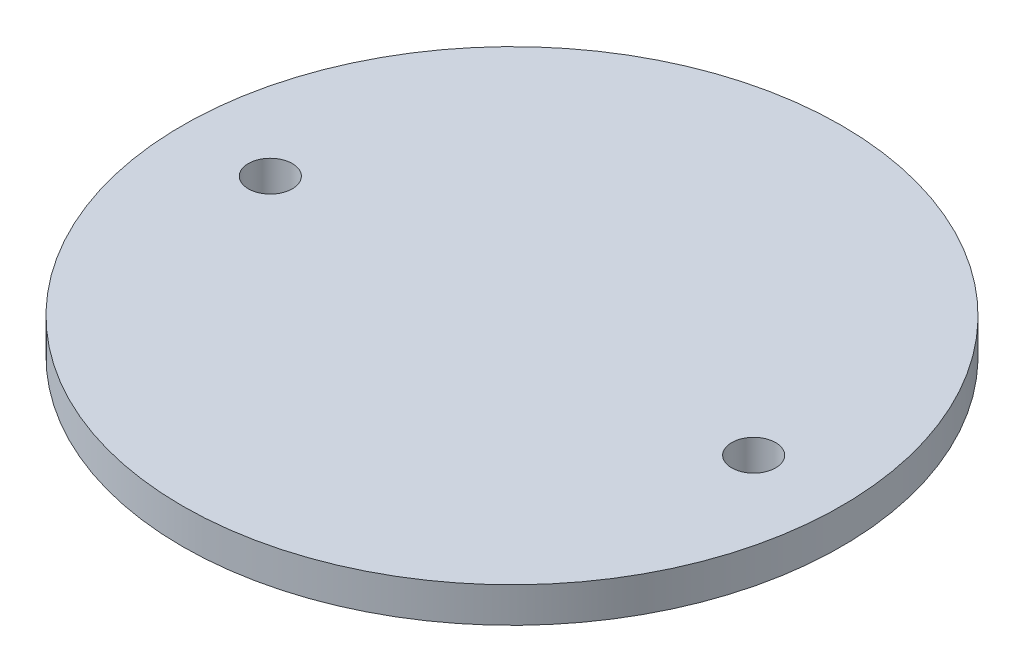
ISO-10303-21;
HEADER;
FILE_DESCRIPTION(('STEP AP214'),'2;1');
FILE_NAME('part.step','',(''),(''),'','','');
FILE_SCHEMA(('AUTOMOTIVE_DESIGN { 1 0 10303 214 1 1 1 1 }'));
ENDSEC;
DATA;
#1=APPLICATION_CONTEXT('core data for automotive mechanical design processes');
#2=APPLICATION_PROTOCOL_DEFINITION('international standard','automotive_design',2000,#1);
#3=PRODUCT_CONTEXT('',#1,'mechanical');
#4=PRODUCT('Part','Part','',(#3));
#5=PRODUCT_RELATED_PRODUCT_CATEGORY('part','',(#4));
#6=PRODUCT_DEFINITION_FORMATION('','',#4);
#7=PRODUCT_DEFINITION_CONTEXT('part definition',#1,'design');
#8=PRODUCT_DEFINITION('design','',#6,#7);
#9=PRODUCT_DEFINITION_SHAPE('','',#8);
#10=(LENGTH_UNIT() NAMED_UNIT(*) SI_UNIT(.MILLI.,.METRE.));
#11=(NAMED_UNIT(*) PLANE_ANGLE_UNIT() SI_UNIT($,.RADIAN.));
#12=(NAMED_UNIT(*) SI_UNIT($,.STERADIAN.) SOLID_ANGLE_UNIT());
#13=UNCERTAINTY_MEASURE_WITH_UNIT(LENGTH_MEASURE(1.E-05),#10,'distance_accuracy_value','');
#14=(GEOMETRIC_REPRESENTATION_CONTEXT(3) GLOBAL_UNCERTAINTY_ASSIGNED_CONTEXT((#13)) GLOBAL_UNIT_ASSIGNED_CONTEXT((#10,
#11,#12)) REPRESENTATION_CONTEXT('',''));
#15=CARTESIAN_POINT('',(0.,0.,0.));
#16=DIRECTION('',(0.,0.,1.));
#17=DIRECTION('',(1.,0.,0.));
#18=AXIS2_PLACEMENT_3D('',#15,#16,#17);
#19=CARTESIAN_POINT('',(0.,4.,0.));
#20=DIRECTION('',(0.,-1.,0.));
#21=DIRECTION('',(0.,0.,-1.));
#22=AXIS2_PLACEMENT_3D('',#19,#20,#21);
#23=CYLINDRICAL_SURFACE('',#22,37.5);
#24=CARTESIAN_POINT('',(0.,4.,0.));
#25=DIRECTION('',(0.,1.,0.));
#26=DIRECTION('',(0.,0.,1.));
#27=AXIS2_PLACEMENT_3D('',#24,#25,#26);
#28=CIRCLE('',#27,37.5);
#29=CARTESIAN_POINT('',(0.,4.,37.5));
#30=VERTEX_POINT('',#29);
#31=EDGE_CURVE('E10',#30,#30,#28,.T.);
#32=ORIENTED_EDGE('',*,*,#31,.F.);
#33=EDGE_LOOP('',(#32));
#34=FACE_BOUND('',#33,.T.);
#35=CARTESIAN_POINT('',(0.,0.,0.));
#36=DIRECTION('',(0.,1.,0.));
#37=DIRECTION('',(0.,0.,1.));
#38=AXIS2_PLACEMENT_3D('',#35,#36,#37);
#39=CIRCLE('',#38,37.5);
#40=CARTESIAN_POINT('',(0.,0.,37.5));
#41=VERTEX_POINT('',#40);
#42=EDGE_CURVE('E34',#41,#41,#39,.T.);
#43=ORIENTED_EDGE('',*,*,#42,.T.);
#44=EDGE_LOOP('',(#43));
#45=FACE_BOUND('',#44,.T.);
#46=ADVANCED_FACE('F31',(#34,#45),#23,.T.);
#47=CARTESIAN_POINT('',(0.,4.,0.));
#48=DIRECTION('',(0.,1.,0.));
#49=DIRECTION('',(0.,0.,1.));
#50=AXIS2_PLACEMENT_3D('',#47,#48,#49);
#51=PLANE('',#50);
#52=CARTESIAN_POINT('',(27.5,4.,0.));
#53=DIRECTION('',(0.,1.,0.));
#54=DIRECTION('',(0.,0.,1.));
#55=AXIS2_PLACEMENT_3D('',#52,#53,#54);
#56=CIRCLE('',#55,2.5);
#57=CARTESIAN_POINT('',(27.5,4.,2.49999999999999));
#58=VERTEX_POINT('',#57);
#59=EDGE_CURVE('E49',#58,#58,#56,.T.);
#60=ORIENTED_EDGE('',*,*,#59,.F.);
#61=EDGE_LOOP('',(#60));
#62=FACE_BOUND('',#61,.T.);
#63=CARTESIAN_POINT('',(-27.5,4.,0.));
#64=DIRECTION('',(0.,1.,0.));
#65=DIRECTION('',(0.,0.,1.));
#66=AXIS2_PLACEMENT_3D('',#63,#64,#65);
#67=CIRCLE('',#66,2.5);
#68=CARTESIAN_POINT('',(-27.5,4.,2.5));
#69=VERTEX_POINT('',#68);
#70=EDGE_CURVE('E43',#69,#69,#67,.T.);
#71=ORIENTED_EDGE('',*,*,#70,.F.);
#72=EDGE_LOOP('',(#71));
#73=FACE_BOUND('',#72,.T.);
#74=ORIENTED_EDGE('',*,*,#31,.T.);
#75=EDGE_LOOP('',(#74));
#76=FACE_BOUND('',#75,.T.);
#77=ADVANCED_FACE('F65',(#62,#73,#76),#51,.T.);
#78=CARTESIAN_POINT('',(0.,0.,0.));
#79=DIRECTION('',(0.,1.,0.));
#80=DIRECTION('',(0.,0.,1.));
#81=AXIS2_PLACEMENT_3D('',#78,#79,#80);
#82=PLANE('',#81);
#83=CARTESIAN_POINT('',(27.5,0.,0.));
#84=DIRECTION('',(0.,1.,0.));
#85=DIRECTION('',(0.,0.,1.));
#86=AXIS2_PLACEMENT_3D('',#83,#84,#85);
#87=CIRCLE('',#86,2.5);
#88=CARTESIAN_POINT('',(27.5,0.,2.49999999999999));
#89=VERTEX_POINT('',#88);
#90=EDGE_CURVE('E46',#89,#89,#87,.T.);
#91=ORIENTED_EDGE('',*,*,#90,.T.);
#92=EDGE_LOOP('',(#91));
#93=FACE_BOUND('',#92,.T.);
#94=CARTESIAN_POINT('',(-27.5,0.,0.));
#95=DIRECTION('',(0.,1.,0.));
#96=DIRECTION('',(0.,0.,1.));
#97=AXIS2_PLACEMENT_3D('',#94,#95,#96);
#98=CIRCLE('',#97,2.5);
#99=CARTESIAN_POINT('',(-27.5,0.,2.5));
#100=VERTEX_POINT('',#99);
#101=EDGE_CURVE('E41',#100,#100,#98,.T.);
#102=ORIENTED_EDGE('',*,*,#101,.T.);
#103=EDGE_LOOP('',(#102));
#104=FACE_BOUND('',#103,.T.);
#105=ORIENTED_EDGE('',*,*,#42,.F.);
#106=EDGE_LOOP('',(#105));
#107=FACE_BOUND('',#106,.T.);
#108=ADVANCED_FACE('F55',(#93,#104,#107),#82,.F.);
#109=CARTESIAN_POINT('',(-27.5,0.,0.));
#110=DIRECTION('',(0.,1.,0.));
#111=DIRECTION('',(0.,0.,1.));
#112=AXIS2_PLACEMENT_3D('',#109,#110,#111);
#113=CYLINDRICAL_SURFACE('',#112,2.5);
#114=ORIENTED_EDGE('',*,*,#101,.F.);
#115=EDGE_LOOP('',(#114));
#116=FACE_BOUND('',#115,.T.);
#117=ORIENTED_EDGE('',*,*,#70,.T.);
#118=EDGE_LOOP('',(#117));
#119=FACE_BOUND('',#118,.T.);
#120=ADVANCED_FACE('F61',(#116,#119),#113,.F.);
#121=CARTESIAN_POINT('',(27.5,0.,0.));
#122=DIRECTION('',(0.,1.,0.));
#123=DIRECTION('',(0.,0.,1.));
#124=AXIS2_PLACEMENT_3D('',#121,#122,#123);
#125=CYLINDRICAL_SURFACE('',#124,2.5);
#126=ORIENTED_EDGE('',*,*,#90,.F.);
#127=EDGE_LOOP('',(#126));
#128=FACE_BOUND('',#127,.T.);
#129=ORIENTED_EDGE('',*,*,#59,.T.);
#130=EDGE_LOOP('',(#129));
#131=FACE_BOUND('',#130,.T.);
#132=ADVANCED_FACE('F58',(#128,#131),#125,.F.);
#133=CLOSED_SHELL('',(#46,#77,#108,#120,#132));
#134=MANIFOLD_SOLID_BREP('B2',#133);
#135=ADVANCED_BREP_SHAPE_REPRESENTATION('',(#18,#134),#14);
#136=SHAPE_DEFINITION_REPRESENTATION(#9,#135);
ENDSEC;
END-ISO-10303-21;
